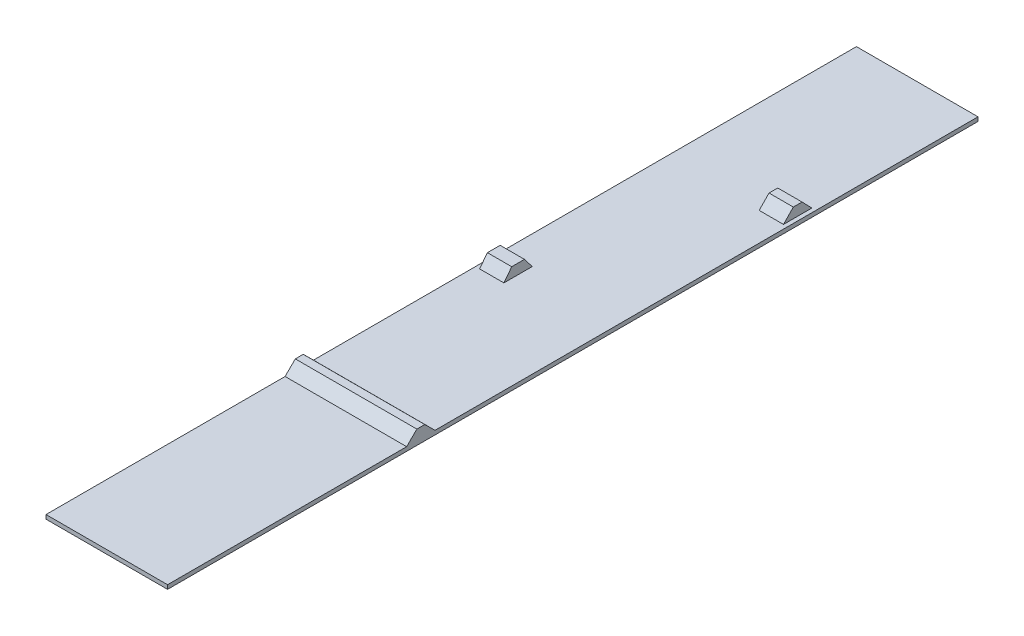
ISO-10303-21;
HEADER;
FILE_DESCRIPTION(('STEP AP214'),'2;1');
FILE_NAME('part.step','',(''),(''),'','','');
FILE_SCHEMA(('AUTOMOTIVE_DESIGN { 1 0 10303 214 1 1 1 1 }'));
ENDSEC;
DATA;
#1=APPLICATION_CONTEXT('core data for automotive mechanical design processes');
#2=APPLICATION_PROTOCOL_DEFINITION('international standard','automotive_design',2000,#1);
#3=PRODUCT_CONTEXT('',#1,'mechanical');
#4=PRODUCT('Part','Part','',(#3));
#5=PRODUCT_RELATED_PRODUCT_CATEGORY('part','',(#4));
#6=PRODUCT_DEFINITION_FORMATION('','',#4);
#7=PRODUCT_DEFINITION_CONTEXT('part definition',#1,'design');
#8=PRODUCT_DEFINITION('design','',#6,#7);
#9=PRODUCT_DEFINITION_SHAPE('','',#8);
#10=(LENGTH_UNIT() NAMED_UNIT(*) SI_UNIT(.MILLI.,.METRE.));
#11=(NAMED_UNIT(*) PLANE_ANGLE_UNIT() SI_UNIT($,.RADIAN.));
#12=(NAMED_UNIT(*) SI_UNIT($,.STERADIAN.) SOLID_ANGLE_UNIT());
#13=UNCERTAINTY_MEASURE_WITH_UNIT(LENGTH_MEASURE(1.E-05),#10,'distance_accuracy_value','');
#14=(GEOMETRIC_REPRESENTATION_CONTEXT(3) GLOBAL_UNCERTAINTY_ASSIGNED_CONTEXT((#13)) GLOBAL_UNIT_ASSIGNED_CONTEXT((#10,
#11,#12)) REPRESENTATION_CONTEXT('',''));
#15=CARTESIAN_POINT('',(0.,0.,0.));
#16=DIRECTION('',(0.,0.,1.));
#17=DIRECTION('',(1.,0.,0.));
#18=AXIS2_PLACEMENT_3D('',#15,#16,#17);
#19=CARTESIAN_POINT('',(0.,10.,0.));
#20=DIRECTION('',(0.,1.,0.));
#21=DIRECTION('',(0.,0.,1.));
#22=AXIS2_PLACEMENT_3D('',#19,#20,#21);
#23=PLANE('',#22);
#24=DIRECTION('',(1.,0.,0.));
#25=VECTOR('',#24,1.);
#26=CARTESIAN_POINT('',(-150.,10.,410.));
#27=LINE('',#26,#25);
#28=CARTESIAN_POINT('',(-150.,10.,410.));
#29=VERTEX_POINT('',#28);
#30=CARTESIAN_POINT('',(150.,10.,410.));
#31=VERTEX_POINT('',#30);
#32=EDGE_CURVE('E179',#29,#31,#27,.T.);
#33=ORIENTED_EDGE('',*,*,#32,.F.);
#34=DIRECTION('',(0.,0.,1.));
#35=VECTOR('',#34,1.);
#36=CARTESIAN_POINT('',(-150.,10.,-1000.));
#37=LINE('',#36,#35);
#38=CARTESIAN_POINT('',(-150.,10.,1000.));
#39=VERTEX_POINT('',#38);
#40=EDGE_CURVE('E247',#29,#39,#37,.T.);
#41=ORIENTED_EDGE('',*,*,#40,.T.);
#42=DIRECTION('',(1.,0.,0.));
#43=VECTOR('',#42,1.);
#44=CARTESIAN_POINT('',(-150.,10.,1000.));
#45=LINE('',#44,#43);
#46=CARTESIAN_POINT('',(150.,10.,1000.));
#47=VERTEX_POINT('',#46);
#48=EDGE_CURVE('E250',#39,#47,#45,.T.);
#49=ORIENTED_EDGE('',*,*,#48,.T.);
#50=DIRECTION('',(0.,0.,-1.));
#51=VECTOR('',#50,1.);
#52=CARTESIAN_POINT('',(150.,10.,-1000.));
#53=LINE('',#52,#51);
#54=EDGE_CURVE('E56',#47,#31,#53,.T.);
#55=ORIENTED_EDGE('',*,*,#54,.T.);
#56=EDGE_LOOP('',(#33,#41,#49,#55));
#57=FACE_BOUND('',#56,.T.);
#58=ADVANCED_FACE('F33',(#57),#23,.T.);
#59=DIRECTION('',(1.,0.,0.));
#60=VECTOR('',#59,1.);
#61=CARTESIAN_POINT('',(-150.,10.,340.));
#62=LINE('',#61,#60);
#63=CARTESIAN_POINT('',(-150.,10.,340.));
#64=VERTEX_POINT('',#63);
#65=CARTESIAN_POINT('',(150.,10.,340.));
#66=VERTEX_POINT('',#65);
#67=EDGE_CURVE('E48',#64,#66,#62,.T.);
#68=ORIENTED_EDGE('',*,*,#67,.T.);
#69=CARTESIAN_POINT('',(150.,10.,-1000.));
#70=VERTEX_POINT('',#69);
#71=EDGE_CURVE('E166',#66,#70,#53,.T.);
#72=ORIENTED_EDGE('',*,*,#71,.T.);
#73=DIRECTION('',(-1.,0.,0.));
#74=VECTOR('',#73,1.);
#75=CARTESIAN_POINT('',(-150.,10.,-1000.));
#76=LINE('',#75,#74);
#77=CARTESIAN_POINT('',(-150.,10.,-1000.));
#78=VERTEX_POINT('',#77);
#79=EDGE_CURVE('E245',#70,#78,#76,.T.);
#80=ORIENTED_EDGE('',*,*,#79,.T.);
#81=EDGE_CURVE('E248',#78,#64,#37,.T.);
#82=ORIENTED_EDGE('',*,*,#81,.T.);
#83=EDGE_LOOP('',(#68,#72,#80,#82));
#84=FACE_BOUND('',#83,.T.);
#85=DIRECTION('',(-1.,0.,0.));
#86=VECTOR('',#85,1.);
#87=CARTESIAN_POINT('',(140.,10.,-600.));
#88=LINE('',#87,#86);
#89=CARTESIAN_POINT('',(140.,10.,-600.));
#90=VERTEX_POINT('',#89);
#91=CARTESIAN_POINT('',(80.,10.,-600.));
#92=VERTEX_POINT('',#91);
#93=EDGE_CURVE('E240',#90,#92,#88,.T.);
#94=ORIENTED_EDGE('',*,*,#93,.F.);
#95=DIRECTION('',(0.,0.,-1.));
#96=VECTOR('',#95,1.);
#97=CARTESIAN_POINT('',(140.,10.,-600.));
#98=LINE('',#97,#96);
#99=CARTESIAN_POINT('',(140.,10.,-530.));
#100=VERTEX_POINT('',#99);
#101=EDGE_CURVE('E214',#100,#90,#98,.T.);
#102=ORIENTED_EDGE('',*,*,#101,.F.);
#103=DIRECTION('',(-1.,0.,0.));
#104=VECTOR('',#103,1.);
#105=CARTESIAN_POINT('',(140.,10.,-530.));
#106=LINE('',#105,#104);
#107=CARTESIAN_POINT('',(80.,10.,-530.));
#108=VERTEX_POINT('',#107);
#109=EDGE_CURVE('E225',#100,#108,#106,.T.);
#110=ORIENTED_EDGE('',*,*,#109,.T.);
#111=DIRECTION('',(0.,0.,-1.));
#112=VECTOR('',#111,1.);
#113=CARTESIAN_POINT('',(80.,10.,-600.));
#114=LINE('',#113,#112);
#115=EDGE_CURVE('E213',#108,#92,#114,.T.);
#116=ORIENTED_EDGE('',*,*,#115,.T.);
#117=EDGE_LOOP('',(#94,#102,#110,#116));
#118=FACE_BOUND('',#117,.T.);
#119=DIRECTION('',(-1.,0.,0.));
#120=VECTOR('',#119,1.);
#121=CARTESIAN_POINT('',(-80.,10.,-130.));
#122=LINE('',#121,#120);
#123=CARTESIAN_POINT('',(-80.,10.,-130.));
#124=VERTEX_POINT('',#123);
#125=CARTESIAN_POINT('',(-140.,10.,-130.));
#126=VERTEX_POINT('',#125);
#127=EDGE_CURVE('E210',#124,#126,#122,.T.);
#128=ORIENTED_EDGE('',*,*,#127,.F.);
#129=DIRECTION('',(0.,0.,-1.));
#130=VECTOR('',#129,1.);
#131=CARTESIAN_POINT('',(-80.,10.,-130.));
#132=LINE('',#131,#130);
#133=CARTESIAN_POINT('',(-80.,10.,-60.0000000000003));
#134=VERTEX_POINT('',#133);
#135=EDGE_CURVE('E184',#134,#124,#132,.T.);
#136=ORIENTED_EDGE('',*,*,#135,.F.);
#137=DIRECTION('',(-1.,0.,0.));
#138=VECTOR('',#137,1.);
#139=CARTESIAN_POINT('',(-80.,10.,-60.0000000000003));
#140=LINE('',#139,#138);
#141=CARTESIAN_POINT('',(-140.,10.,-60.0000000000003));
#142=VERTEX_POINT('',#141);
#143=EDGE_CURVE('E195',#134,#142,#140,.T.);
#144=ORIENTED_EDGE('',*,*,#143,.T.);
#145=DIRECTION('',(0.,0.,-1.));
#146=VECTOR('',#145,1.);
#147=CARTESIAN_POINT('',(-140.,10.,-130.));
#148=LINE('',#147,#146);
#149=EDGE_CURVE('E181',#142,#126,#148,.T.);
#150=ORIENTED_EDGE('',*,*,#149,.T.);
#151=EDGE_LOOP('',(#128,#136,#144,#150));
#152=FACE_BOUND('',#151,.T.);
#153=ADVANCED_FACE('F285',(#84,#118,#152),#23,.T.);
#154=CARTESIAN_POINT('',(150.,10.,-1000.));
#155=DIRECTION('',(-1.,0.,0.));
#156=DIRECTION('',(0.,0.,1.));
#157=AXIS2_PLACEMENT_3D('',#154,#155,#156);
#158=PLANE('',#157);
#159=DIRECTION('',(0.,0.,-1.));
#160=VECTOR('',#159,1.);
#161=CARTESIAN_POINT('',(150.,0.,-1000.));
#162=LINE('',#161,#160);
#163=CARTESIAN_POINT('',(150.,0.,1000.));
#164=VERTEX_POINT('',#163);
#165=CARTESIAN_POINT('',(150.,0.,-1000.));
#166=VERTEX_POINT('',#165);
#167=EDGE_CURVE('E243',#164,#166,#162,.T.);
#168=ORIENTED_EDGE('',*,*,#167,.T.);
#169=DIRECTION('',(0.,-1.,0.));
#170=VECTOR('',#169,1.);
#171=CARTESIAN_POINT('',(150.,10.,-1000.));
#172=LINE('',#171,#170);
#173=EDGE_CURVE('E11',#70,#166,#172,.T.);
#174=ORIENTED_EDGE('',*,*,#173,.F.);
#175=ORIENTED_EDGE('',*,*,#71,.F.);
#176=DIRECTION('',(0.,0.703887950809821,0.710311025329574));
#177=VECTOR('',#176,1.);
#178=CARTESIAN_POINT('',(150.,35.,365.228128444036));
#179=LINE('',#178,#177);
#180=CARTESIAN_POINT('',(150.,35.,365.228128444036));
#181=VERTEX_POINT('',#180);
#182=EDGE_CURVE('E150',#66,#181,#179,.T.);
#183=ORIENTED_EDGE('',*,*,#182,.T.);
#184=DIRECTION('',(0.,0.,1.));
#185=VECTOR('',#184,1.);
#186=CARTESIAN_POINT('',(150.,35.,384.771871555964));
#187=LINE('',#186,#185);
#188=CARTESIAN_POINT('',(150.,35.,384.771871555964));
#189=VERTEX_POINT('',#188);
#190=EDGE_CURVE('E163',#181,#189,#187,.T.);
#191=ORIENTED_EDGE('',*,*,#190,.T.);
#192=DIRECTION('',(0.,-0.703887950809822,0.710311025329573));
#193=VECTOR('',#192,1.);
#194=CARTESIAN_POINT('',(150.,10.,410.));
#195=LINE('',#194,#193);
#196=EDGE_CURVE('E169',#189,#31,#195,.T.);
#197=ORIENTED_EDGE('',*,*,#196,.T.);
#198=ORIENTED_EDGE('',*,*,#54,.F.);
#199=DIRECTION('',(0.,-1.,0.));
#200=VECTOR('',#199,1.);
#201=CARTESIAN_POINT('',(150.,10.,1000.));
#202=LINE('',#201,#200);
#203=EDGE_CURVE('E252',#47,#164,#202,.T.);
#204=ORIENTED_EDGE('',*,*,#203,.T.);
#205=EDGE_LOOP('',(#168,#174,#175,#183,#191,#197,#198,#204));
#206=FACE_BOUND('',#205,.T.);
#207=ADVANCED_FACE('F35',(#206),#158,.F.);
#208=CARTESIAN_POINT('',(-150.,10.,-1000.));
#209=DIRECTION('',(0.,0.,1.));
#210=DIRECTION('',(1.,0.,0.));
#211=AXIS2_PLACEMENT_3D('',#208,#209,#210);
#212=PLANE('',#211);
#213=DIRECTION('',(-1.,0.,0.));
#214=VECTOR('',#213,1.);
#215=CARTESIAN_POINT('',(-150.,0.,-1000.));
#216=LINE('',#215,#214);
#217=CARTESIAN_POINT('',(-150.,0.,-1000.));
#218=VERTEX_POINT('',#217);
#219=EDGE_CURVE('E254',#166,#218,#216,.T.);
#220=ORIENTED_EDGE('',*,*,#219,.T.);
#221=DIRECTION('',(0.,-1.,0.));
#222=VECTOR('',#221,1.);
#223=CARTESIAN_POINT('',(-150.,10.,-1000.));
#224=LINE('',#223,#222);
#225=EDGE_CURVE('E41',#78,#218,#224,.T.);
#226=ORIENTED_EDGE('',*,*,#225,.F.);
#227=ORIENTED_EDGE('',*,*,#79,.F.);
#228=ORIENTED_EDGE('',*,*,#173,.T.);
#229=EDGE_LOOP('',(#220,#226,#227,#228));
#230=FACE_BOUND('',#229,.T.);
#231=ADVANCED_FACE('F299',(#230),#212,.F.);
#232=CARTESIAN_POINT('',(-150.,10.,-1000.));
#233=DIRECTION('',(1.,0.,0.));
#234=DIRECTION('',(0.,0.,-1.));
#235=AXIS2_PLACEMENT_3D('',#232,#233,#234);
#236=PLANE('',#235);
#237=DIRECTION('',(0.,0.,1.));
#238=VECTOR('',#237,1.);
#239=CARTESIAN_POINT('',(-150.,0.,-1000.));
#240=LINE('',#239,#238);
#241=CARTESIAN_POINT('',(-150.,0.,1000.));
#242=VERTEX_POINT('',#241);
#243=EDGE_CURVE('E256',#218,#242,#240,.T.);
#244=ORIENTED_EDGE('',*,*,#243,.T.);
#245=DIRECTION('',(0.,-1.,0.));
#246=VECTOR('',#245,1.);
#247=CARTESIAN_POINT('',(-150.,10.,1000.));
#248=LINE('',#247,#246);
#249=EDGE_CURVE('E262',#39,#242,#248,.T.);
#250=ORIENTED_EDGE('',*,*,#249,.F.);
#251=ORIENTED_EDGE('',*,*,#40,.F.);
#252=DIRECTION('',(0.,-0.703887950809822,0.710311025329573));
#253=VECTOR('',#252,1.);
#254=CARTESIAN_POINT('',(-150.,10.,410.));
#255=LINE('',#254,#253);
#256=CARTESIAN_POINT('',(-150.,35.,384.771871555964));
#257=VERTEX_POINT('',#256);
#258=EDGE_CURVE('E176',#257,#29,#255,.T.);
#259=ORIENTED_EDGE('',*,*,#258,.F.);
#260=DIRECTION('',(0.,0.,1.));
#261=VECTOR('',#260,1.);
#262=CARTESIAN_POINT('',(-150.,35.,384.771871555964));
#263=LINE('',#262,#261);
#264=CARTESIAN_POINT('',(-150.,35.,365.228128444036));
#265=VERTEX_POINT('',#264);
#266=EDGE_CURVE('E174',#265,#257,#263,.T.);
#267=ORIENTED_EDGE('',*,*,#266,.F.);
#268=DIRECTION('',(0.,0.703887950809821,0.710311025329574));
#269=VECTOR('',#268,1.);
#270=CARTESIAN_POINT('',(-150.,35.,365.228128444036));
#271=LINE('',#270,#269);
#272=EDGE_CURVE('E152',#64,#265,#271,.T.);
#273=ORIENTED_EDGE('',*,*,#272,.F.);
#274=ORIENTED_EDGE('',*,*,#81,.F.);
#275=ORIENTED_EDGE('',*,*,#225,.T.);
#276=EDGE_LOOP('',(#244,#250,#251,#259,#267,#273,#274,#275));
#277=FACE_BOUND('',#276,.T.);
#278=ADVANCED_FACE('F269',(#277),#236,.F.);
#279=CARTESIAN_POINT('',(-150.,10.,1000.));
#280=DIRECTION('',(0.,0.,-1.));
#281=DIRECTION('',(-1.,0.,0.));
#282=AXIS2_PLACEMENT_3D('',#279,#280,#281);
#283=PLANE('',#282);
#284=DIRECTION('',(1.,0.,0.));
#285=VECTOR('',#284,1.);
#286=CARTESIAN_POINT('',(-150.,0.,1000.));
#287=LINE('',#286,#285);
#288=EDGE_CURVE('E258',#242,#164,#287,.T.);
#289=ORIENTED_EDGE('',*,*,#288,.T.);
#290=ORIENTED_EDGE('',*,*,#203,.F.);
#291=ORIENTED_EDGE('',*,*,#48,.F.);
#292=ORIENTED_EDGE('',*,*,#249,.T.);
#293=EDGE_LOOP('',(#289,#290,#291,#292));
#294=FACE_BOUND('',#293,.T.);
#295=ADVANCED_FACE('F279',(#294),#283,.F.);
#296=CARTESIAN_POINT('',(0.,0.,0.));
#297=DIRECTION('',(0.,1.,0.));
#298=DIRECTION('',(0.,0.,1.));
#299=AXIS2_PLACEMENT_3D('',#296,#297,#298);
#300=PLANE('',#299);
#301=ORIENTED_EDGE('',*,*,#167,.F.);
#302=ORIENTED_EDGE('',*,*,#288,.F.);
#303=ORIENTED_EDGE('',*,*,#243,.F.);
#304=ORIENTED_EDGE('',*,*,#219,.F.);
#305=EDGE_LOOP('',(#301,#302,#303,#304));
#306=FACE_BOUND('',#305,.T.);
#307=ADVANCED_FACE('F276',(#306),#300,.F.);
#308=CARTESIAN_POINT('',(140.,35.,-575.783531691101));
#309=DIRECTION('',(0.,-0.695761397219521,0.718272983021873));
#310=DIRECTION('',(0.,-0.718272983021873,-0.695761397219521));
#311=AXIS2_PLACEMENT_3D('',#308,#309,#310);
#312=PLANE('',#311);
#313=DIRECTION('',(0.,0.718272983021873,0.695761397219521));
#314=VECTOR('',#313,1.);
#315=CARTESIAN_POINT('',(80.,35.,-575.783531691101));
#316=LINE('',#315,#314);
#317=CARTESIAN_POINT('',(80.,35.,-575.783531691101));
#318=VERTEX_POINT('',#317);
#319=EDGE_CURVE('E227',#92,#318,#316,.T.);
#320=ORIENTED_EDGE('',*,*,#319,.T.);
#321=DIRECTION('',(-1.,0.,0.));
#322=VECTOR('',#321,1.);
#323=CARTESIAN_POINT('',(140.,35.,-575.783531691101));
#324=LINE('',#323,#322);
#325=CARTESIAN_POINT('',(140.,35.,-575.783531691101));
#326=VERTEX_POINT('',#325);
#327=EDGE_CURVE('E237',#326,#318,#324,.T.);
#328=ORIENTED_EDGE('',*,*,#327,.F.);
#329=DIRECTION('',(0.,0.718272983021873,0.695761397219521));
#330=VECTOR('',#329,1.);
#331=CARTESIAN_POINT('',(140.,35.,-575.783531691101));
#332=LINE('',#331,#330);
#333=EDGE_CURVE('E217',#90,#326,#332,.T.);
#334=ORIENTED_EDGE('',*,*,#333,.F.);
#335=ORIENTED_EDGE('',*,*,#93,.T.);
#336=EDGE_LOOP('',(#320,#328,#334,#335));
#337=FACE_BOUND('',#336,.T.);
#338=ADVANCED_FACE('F292',(#337),#312,.F.);
#339=CARTESIAN_POINT('',(140.,35.,-554.2164683089));
#340=DIRECTION('',(0.,-1.,0.));
#341=DIRECTION('',(0.,0.,-1.));
#342=AXIS2_PLACEMENT_3D('',#339,#340,#341);
#343=PLANE('',#342);
#344=DIRECTION('',(0.,0.,1.));
#345=VECTOR('',#344,1.);
#346=CARTESIAN_POINT('',(80.,35.,-554.2164683089));
#347=LINE('',#346,#345);
#348=CARTESIAN_POINT('',(80.,35.,-554.2164683089));
#349=VERTEX_POINT('',#348);
#350=EDGE_CURVE('E229',#318,#349,#347,.T.);
#351=ORIENTED_EDGE('',*,*,#350,.T.);
#352=DIRECTION('',(-1.,0.,0.));
#353=VECTOR('',#352,1.);
#354=CARTESIAN_POINT('',(140.,35.,-554.2164683089));
#355=LINE('',#354,#353);
#356=CARTESIAN_POINT('',(140.,35.,-554.2164683089));
#357=VERTEX_POINT('',#356);
#358=EDGE_CURVE('E234',#357,#349,#355,.T.);
#359=ORIENTED_EDGE('',*,*,#358,.F.);
#360=DIRECTION('',(0.,0.,1.));
#361=VECTOR('',#360,1.);
#362=CARTESIAN_POINT('',(140.,35.,-554.2164683089));
#363=LINE('',#362,#361);
#364=EDGE_CURVE('E220',#326,#357,#363,.T.);
#365=ORIENTED_EDGE('',*,*,#364,.F.);
#366=ORIENTED_EDGE('',*,*,#327,.T.);
#367=EDGE_LOOP('',(#351,#359,#365,#366));
#368=FACE_BOUND('',#367,.T.);
#369=ADVANCED_FACE('F347',(#368),#343,.F.);
#370=CARTESIAN_POINT('',(140.,10.,-530.));
#371=DIRECTION('',(0.,-0.695761397219521,-0.718272983021873));
#372=DIRECTION('',(0.,0.718272983021873,-0.695761397219521));
#373=AXIS2_PLACEMENT_3D('',#370,#371,#372);
#374=PLANE('',#373);
#375=DIRECTION('',(0.,-0.718272983021873,0.695761397219521));
#376=VECTOR('',#375,1.);
#377=CARTESIAN_POINT('',(80.,10.,-530.));
#378=LINE('',#377,#376);
#379=EDGE_CURVE('E218',#349,#108,#378,.T.);
#380=ORIENTED_EDGE('',*,*,#379,.T.);
#381=ORIENTED_EDGE('',*,*,#109,.F.);
#382=DIRECTION('',(0.,-0.718272983021873,0.695761397219521));
#383=VECTOR('',#382,1.);
#384=CARTESIAN_POINT('',(140.,10.,-530.));
#385=LINE('',#384,#383);
#386=EDGE_CURVE('E222',#357,#100,#385,.T.);
#387=ORIENTED_EDGE('',*,*,#386,.F.);
#388=ORIENTED_EDGE('',*,*,#358,.T.);
#389=EDGE_LOOP('',(#380,#381,#387,#388));
#390=FACE_BOUND('',#389,.T.);
#391=ADVANCED_FACE('F341',(#390),#374,.F.);
#392=CARTESIAN_POINT('',(140.,0.,0.));
#393=DIRECTION('',(-1.,0.,0.));
#394=DIRECTION('',(0.,0.,1.));
#395=AXIS2_PLACEMENT_3D('',#392,#393,#394);
#396=PLANE('',#395);
#397=ORIENTED_EDGE('',*,*,#101,.T.);
#398=ORIENTED_EDGE('',*,*,#333,.T.);
#399=ORIENTED_EDGE('',*,*,#364,.T.);
#400=ORIENTED_EDGE('',*,*,#386,.T.);
#401=EDGE_LOOP('',(#397,#398,#399,#400));
#402=FACE_BOUND('',#401,.T.);
#403=ADVANCED_FACE('F338',(#402),#396,.F.);
#404=CARTESIAN_POINT('',(80.,0.,0.));
#405=DIRECTION('',(-1.,0.,0.));
#406=DIRECTION('',(0.,0.,1.));
#407=AXIS2_PLACEMENT_3D('',#404,#405,#406);
#408=PLANE('',#407);
#409=ORIENTED_EDGE('',*,*,#115,.F.);
#410=ORIENTED_EDGE('',*,*,#379,.F.);
#411=ORIENTED_EDGE('',*,*,#350,.F.);
#412=ORIENTED_EDGE('',*,*,#319,.F.);
#413=EDGE_LOOP('',(#409,#410,#411,#412));
#414=FACE_BOUND('',#413,.T.);
#415=ADVANCED_FACE('F334',(#414),#408,.T.);
#416=CARTESIAN_POINT('',(-80.,35.,-110.721704856393));
#417=DIRECTION('',(0.,-0.610656113000407,0.791895896980932));
#418=DIRECTION('',(0.,-0.791895896980932,-0.610656113000407));
#419=AXIS2_PLACEMENT_3D('',#416,#417,#418);
#420=PLANE('',#419);
#421=DIRECTION('',(0.,0.791895896980932,0.610656113000407));
#422=VECTOR('',#421,1.);
#423=CARTESIAN_POINT('',(-140.,35.,-110.721704856393));
#424=LINE('',#423,#422);
#425=CARTESIAN_POINT('',(-140.,35.,-110.721704856393));
#426=VERTEX_POINT('',#425);
#427=EDGE_CURVE('E197',#126,#426,#424,.T.);
#428=ORIENTED_EDGE('',*,*,#427,.T.);
#429=DIRECTION('',(-1.,0.,0.));
#430=VECTOR('',#429,1.);
#431=CARTESIAN_POINT('',(-80.,35.,-110.721704856393));
#432=LINE('',#431,#430);
#433=CARTESIAN_POINT('',(-80.,35.,-110.721704856393));
#434=VERTEX_POINT('',#433);
#435=EDGE_CURVE('E207',#434,#426,#432,.T.);
#436=ORIENTED_EDGE('',*,*,#435,.F.);
#437=DIRECTION('',(0.,0.791895896980932,0.610656113000407));
#438=VECTOR('',#437,1.);
#439=CARTESIAN_POINT('',(-80.,35.,-110.721704856393));
#440=LINE('',#439,#438);
#441=EDGE_CURVE('E187',#124,#434,#440,.T.);
#442=ORIENTED_EDGE('',*,*,#441,.F.);
#443=ORIENTED_EDGE('',*,*,#127,.T.);
#444=EDGE_LOOP('',(#428,#436,#442,#443));
#445=FACE_BOUND('',#444,.T.);
#446=ADVANCED_FACE('F312',(#445),#420,.F.);
#447=CARTESIAN_POINT('',(-80.,35.,-79.2782951436077));
#448=DIRECTION('',(0.,-1.,0.));
#449=DIRECTION('',(0.,0.,-1.));
#450=AXIS2_PLACEMENT_3D('',#447,#448,#449);
#451=PLANE('',#450);
#452=DIRECTION('',(0.,0.,1.));
#453=VECTOR('',#452,1.);
#454=CARTESIAN_POINT('',(-140.,35.,-79.2782951436077));
#455=LINE('',#454,#453);
#456=CARTESIAN_POINT('',(-140.,35.,-79.2782951436077));
#457=VERTEX_POINT('',#456);
#458=EDGE_CURVE('E199',#426,#457,#455,.T.);
#459=ORIENTED_EDGE('',*,*,#458,.T.);
#460=DIRECTION('',(-1.,0.,0.));
#461=VECTOR('',#460,1.);
#462=CARTESIAN_POINT('',(-80.,35.,-79.2782951436077));
#463=LINE('',#462,#461);
#464=CARTESIAN_POINT('',(-80.,35.,-79.2782951436077));
#465=VERTEX_POINT('',#464);
#466=EDGE_CURVE('E204',#465,#457,#463,.T.);
#467=ORIENTED_EDGE('',*,*,#466,.F.);
#468=DIRECTION('',(0.,0.,1.));
#469=VECTOR('',#468,1.);
#470=CARTESIAN_POINT('',(-80.,35.,-79.2782951436077));
#471=LINE('',#470,#469);
#472=EDGE_CURVE('E190',#434,#465,#471,.T.);
#473=ORIENTED_EDGE('',*,*,#472,.F.);
#474=ORIENTED_EDGE('',*,*,#435,.T.);
#475=EDGE_LOOP('',(#459,#467,#473,#474));
#476=FACE_BOUND('',#475,.T.);
#477=ADVANCED_FACE('F326',(#476),#451,.F.);
#478=CARTESIAN_POINT('',(-80.,10.,-60.0000000000003));
#479=DIRECTION('',(0.,-0.610656113000407,-0.791895896980932));
#480=DIRECTION('',(0.,0.791895896980932,-0.610656113000407));
#481=AXIS2_PLACEMENT_3D('',#478,#479,#480);
#482=PLANE('',#481);
#483=DIRECTION('',(0.,-0.791895896980932,0.610656113000407));
#484=VECTOR('',#483,1.);
#485=CARTESIAN_POINT('',(-140.,10.,-60.0000000000003));
#486=LINE('',#485,#484);
#487=EDGE_CURVE('E188',#457,#142,#486,.T.);
#488=ORIENTED_EDGE('',*,*,#487,.T.);
#489=ORIENTED_EDGE('',*,*,#143,.F.);
#490=DIRECTION('',(0.,-0.791895896980932,0.610656113000407));
#491=VECTOR('',#490,1.);
#492=CARTESIAN_POINT('',(-80.,10.,-60.0000000000003));
#493=LINE('',#492,#491);
#494=EDGE_CURVE('E192',#465,#134,#493,.T.);
#495=ORIENTED_EDGE('',*,*,#494,.F.);
#496=ORIENTED_EDGE('',*,*,#466,.T.);
#497=EDGE_LOOP('',(#488,#489,#495,#496));
#498=FACE_BOUND('',#497,.T.);
#499=ADVANCED_FACE('F320',(#498),#482,.F.);
#500=CARTESIAN_POINT('',(-80.,0.,0.));
#501=DIRECTION('',(-1.,0.,0.));
#502=DIRECTION('',(0.,0.,1.));
#503=AXIS2_PLACEMENT_3D('',#500,#501,#502);
#504=PLANE('',#503);
#505=ORIENTED_EDGE('',*,*,#135,.T.);
#506=ORIENTED_EDGE('',*,*,#441,.T.);
#507=ORIENTED_EDGE('',*,*,#472,.T.);
#508=ORIENTED_EDGE('',*,*,#494,.T.);
#509=EDGE_LOOP('',(#505,#506,#507,#508));
#510=FACE_BOUND('',#509,.T.);
#511=ADVANCED_FACE('F315',(#510),#504,.F.);
#512=CARTESIAN_POINT('',(-140.,0.,0.));
#513=DIRECTION('',(-1.,0.,0.));
#514=DIRECTION('',(0.,0.,1.));
#515=AXIS2_PLACEMENT_3D('',#512,#513,#514);
#516=PLANE('',#515);
#517=ORIENTED_EDGE('',*,*,#149,.F.);
#518=ORIENTED_EDGE('',*,*,#487,.F.);
#519=ORIENTED_EDGE('',*,*,#458,.F.);
#520=ORIENTED_EDGE('',*,*,#427,.F.);
#521=EDGE_LOOP('',(#517,#518,#519,#520));
#522=FACE_BOUND('',#521,.T.);
#523=ADVANCED_FACE('F324',(#522),#516,.T.);
#524=CARTESIAN_POINT('',(-150.,10.,410.));
#525=DIRECTION('',(0.,0.710311025329573,0.703887950809822));
#526=DIRECTION('',(0.,-0.703887950809822,0.710311025329573));
#527=AXIS2_PLACEMENT_3D('',#524,#525,#526);
#528=PLANE('',#527);
#529=ORIENTED_EDGE('',*,*,#32,.T.);
#530=ORIENTED_EDGE('',*,*,#196,.F.);
#531=DIRECTION('',(1.,0.,0.));
#532=VECTOR('',#531,1.);
#533=CARTESIAN_POINT('',(-150.,35.,384.771871555964));
#534=LINE('',#533,#532);
#535=EDGE_CURVE('E157',#257,#189,#534,.T.);
#536=ORIENTED_EDGE('',*,*,#535,.F.);
#537=ORIENTED_EDGE('',*,*,#258,.T.);
#538=EDGE_LOOP('',(#529,#530,#536,#537));
#539=FACE_BOUND('',#538,.T.);
#540=ADVANCED_FACE('F282',(#539),#528,.T.);
#541=CARTESIAN_POINT('',(-150.,35.,384.771871555964));
#542=DIRECTION('',(0.,1.,0.));
#543=DIRECTION('',(0.,0.,1.));
#544=AXIS2_PLACEMENT_3D('',#541,#542,#543);
#545=PLANE('',#544);
#546=ORIENTED_EDGE('',*,*,#535,.T.);
#547=ORIENTED_EDGE('',*,*,#190,.F.);
#548=DIRECTION('',(1.,0.,0.));
#549=VECTOR('',#548,1.);
#550=CARTESIAN_POINT('',(-150.,35.,365.228128444036));
#551=LINE('',#550,#549);
#552=EDGE_CURVE('E147',#265,#181,#551,.T.);
#553=ORIENTED_EDGE('',*,*,#552,.F.);
#554=ORIENTED_EDGE('',*,*,#266,.T.);
#555=EDGE_LOOP('',(#546,#547,#553,#554));
#556=FACE_BOUND('',#555,.T.);
#557=ADVANCED_FACE('F168',(#556),#545,.T.);
#558=CARTESIAN_POINT('',(-150.,35.,365.228128444036));
#559=DIRECTION('',(0.,0.710311025329574,-0.703887950809821));
#560=DIRECTION('',(0.,0.703887950809821,0.710311025329574));
#561=AXIS2_PLACEMENT_3D('',#558,#559,#560);
#562=PLANE('',#561);
#563=ORIENTED_EDGE('',*,*,#552,.T.);
#564=ORIENTED_EDGE('',*,*,#182,.F.);
#565=ORIENTED_EDGE('',*,*,#67,.F.);
#566=ORIENTED_EDGE('',*,*,#272,.T.);
#567=EDGE_LOOP('',(#563,#564,#565,#566));
#568=FACE_BOUND('',#567,.T.);
#569=ADVANCED_FACE('F149',(#568),#562,.T.);
#570=CLOSED_SHELL('',(#58,#153,#207,#231,#278,#295,#307,#338,#369,#391,#403,#415,#446,#477,#499,
#511,#523,#540,#557,#569));
#571=MANIFOLD_SOLID_BREP('B2',#570);
#572=ADVANCED_BREP_SHAPE_REPRESENTATION('',(#18,#571),#14);
#573=SHAPE_DEFINITION_REPRESENTATION(#9,#572);
ENDSEC;
END-ISO-10303-21;
